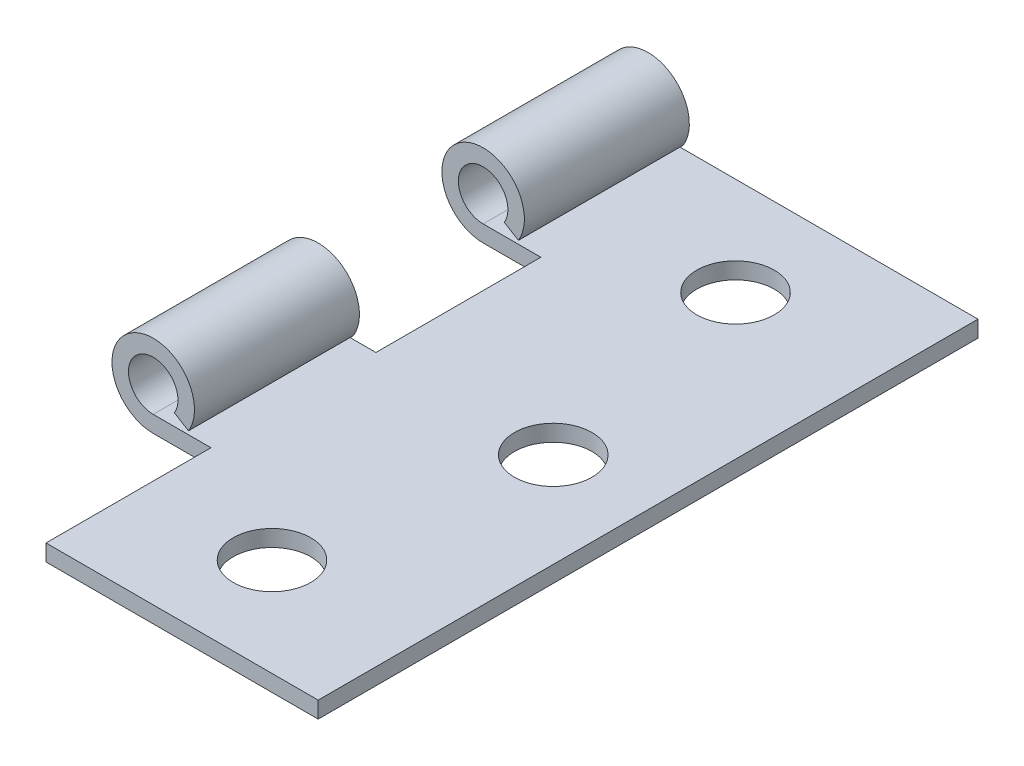
ISO-10303-21;
HEADER;
FILE_DESCRIPTION(('STEP AP214'),'2;1');
FILE_NAME('part.step','',(''),(''),'','','');
FILE_SCHEMA(('AUTOMOTIVE_DESIGN { 1 0 10303 214 1 1 1 1 }'));
ENDSEC;
DATA;
#1=APPLICATION_CONTEXT('core data for automotive mechanical design processes');
#2=APPLICATION_PROTOCOL_DEFINITION('international standard','automotive_design',2000,#1);
#3=PRODUCT_CONTEXT('',#1,'mechanical');
#4=PRODUCT('Part','Part','',(#3));
#5=PRODUCT_RELATED_PRODUCT_CATEGORY('part','',(#4));
#6=PRODUCT_DEFINITION_FORMATION('','',#4);
#7=PRODUCT_DEFINITION_CONTEXT('part definition',#1,'design');
#8=PRODUCT_DEFINITION('design','',#6,#7);
#9=PRODUCT_DEFINITION_SHAPE('','',#8);
#10=(LENGTH_UNIT() NAMED_UNIT(*) SI_UNIT(.MILLI.,.METRE.));
#11=(NAMED_UNIT(*) PLANE_ANGLE_UNIT() SI_UNIT($,.RADIAN.));
#12=(NAMED_UNIT(*) SI_UNIT($,.STERADIAN.) SOLID_ANGLE_UNIT());
#13=UNCERTAINTY_MEASURE_WITH_UNIT(LENGTH_MEASURE(1.E-05),#10,'distance_accuracy_value','');
#14=(GEOMETRIC_REPRESENTATION_CONTEXT(3) GLOBAL_UNCERTAINTY_ASSIGNED_CONTEXT((#13)) GLOBAL_UNIT_ASSIGNED_CONTEXT((#10,
#11,#12)) REPRESENTATION_CONTEXT('',''));
#15=CARTESIAN_POINT('',(0.,0.,0.));
#16=DIRECTION('',(0.,0.,1.));
#17=DIRECTION('',(1.,0.,0.));
#18=AXIS2_PLACEMENT_3D('',#15,#16,#17);
#19=CARTESIAN_POINT('',(0.,0.,40.));
#20=DIRECTION('',(0.,0.,-1.));
#21=DIRECTION('',(-1.,0.,0.));
#22=AXIS2_PLACEMENT_3D('',#19,#20,#21);
#23=CYLINDRICAL_SURFACE('',#22,1.5);
#24=DIRECTION('',(0.,0.,-1.));
#25=VECTOR('',#24,1.);
#26=CARTESIAN_POINT('',(1.28330701874384,-0.776610002280936,40.));
#27=LINE('',#26,#25);
#28=CARTESIAN_POINT('',(1.28330701874384,-0.776610002280936,9.99999999999999));
#29=VERTEX_POINT('',#28);
#30=CARTESIAN_POINT('',(1.28330701874384,-0.776610002280936,0.));
#31=VERTEX_POINT('',#30);
#32=EDGE_CURVE('E238',#29,#31,#27,.T.);
#33=ORIENTED_EDGE('',*,*,#32,.F.);
#34=CARTESIAN_POINT('',(0.,0.,9.99999999999999));
#35=DIRECTION('',(0.,0.,-1.));
#36=DIRECTION('',(-1.,0.,0.));
#37=AXIS2_PLACEMENT_3D('',#34,#35,#36);
#38=CIRCLE('',#37,1.5);
#39=CARTESIAN_POINT('',(0.,-1.5,9.99999999999999));
#40=VERTEX_POINT('',#39);
#41=EDGE_CURVE('E193',#29,#40,#38,.F.);
#42=ORIENTED_EDGE('',*,*,#41,.T.);
#43=DIRECTION('',(0.,0.,-1.));
#44=VECTOR('',#43,1.);
#45=CARTESIAN_POINT('',(0.,-1.5,40.));
#46=LINE('',#45,#44);
#47=CARTESIAN_POINT('',(0.,-1.5,0.));
#48=VERTEX_POINT('',#47);
#49=EDGE_CURVE('E210',#40,#48,#46,.T.);
#50=ORIENTED_EDGE('',*,*,#49,.T.);
#51=CARTESIAN_POINT('',(0.,0.,0.));
#52=DIRECTION('',(0.,0.,-1.));
#53=DIRECTION('',(-1.,0.,0.));
#54=AXIS2_PLACEMENT_3D('',#51,#52,#53);
#55=CIRCLE('',#54,1.5);
#56=EDGE_CURVE('E201',#48,#31,#55,.T.);
#57=ORIENTED_EDGE('',*,*,#56,.T.);
#58=EDGE_LOOP('',(#33,#42,#50,#57));
#59=FACE_BOUND('',#58,.T.);
#60=ADVANCED_FACE('F33',(#59),#23,.F.);
#61=CARTESIAN_POINT('',(2.13884503123973,-1.29435000380156,40.));
#62=DIRECTION('',(-0.517740001520625,-0.855538012495893,0.));
#63=DIRECTION('',(0.855538012495893,-0.517740001520625,0.));
#64=AXIS2_PLACEMENT_3D('',#61,#62,#63);
#65=PLANE('',#64);
#66=DIRECTION('',(0.855538012495893,-0.517740001520625,0.));
#67=VECTOR('',#66,1.);
#68=CARTESIAN_POINT('',(2.13884503123973,-1.29435000380156,9.99999999999999));
#69=LINE('',#68,#67);
#70=CARTESIAN_POINT('',(2.13884503123973,-1.29435000380156,9.99999999999999));
#71=VERTEX_POINT('',#70);
#72=EDGE_CURVE('E196',#29,#71,#69,.T.);
#73=ORIENTED_EDGE('',*,*,#72,.F.);
#74=ORIENTED_EDGE('',*,*,#32,.T.);
#75=DIRECTION('',(-0.855538012495893,0.517740001520625,0.));
#76=VECTOR('',#75,1.);
#77=CARTESIAN_POINT('',(2.13884503123973,-1.29435000380156,0.));
#78=LINE('',#77,#76);
#79=CARTESIAN_POINT('',(2.13884503123973,-1.29435000380156,0.));
#80=VERTEX_POINT('',#79);
#81=EDGE_CURVE('E213',#80,#31,#78,.T.);
#82=ORIENTED_EDGE('',*,*,#81,.F.);
#83=DIRECTION('',(0.,0.,-1.));
#84=VECTOR('',#83,1.);
#85=CARTESIAN_POINT('',(2.13884503123973,-1.29435000380156,40.));
#86=LINE('',#85,#84);
#87=EDGE_CURVE('E235',#71,#80,#86,.T.);
#88=ORIENTED_EDGE('',*,*,#87,.F.);
#89=EDGE_LOOP('',(#73,#74,#82,#88));
#90=FACE_BOUND('',#89,.T.);
#91=ADVANCED_FACE('F277',(#90),#65,.T.);
#92=CARTESIAN_POINT('',(0.,0.,40.));
#93=DIRECTION('',(0.,0.,-1.));
#94=DIRECTION('',(-1.,0.,0.));
#95=AXIS2_PLACEMENT_3D('',#92,#93,#94);
#96=CYLINDRICAL_SURFACE('',#95,2.5);
#97=CARTESIAN_POINT('',(0.,0.,30.));
#98=DIRECTION('',(0.,0.,-1.));
#99=DIRECTION('',(-1.,0.,0.));
#100=AXIS2_PLACEMENT_3D('',#97,#98,#99);
#101=CIRCLE('',#100,2.5);
#102=CARTESIAN_POINT('',(2.13884503123973,-1.29435000380156,30.));
#103=VERTEX_POINT('',#102);
#104=CARTESIAN_POINT('',(0.,-2.5,30.));
#105=VERTEX_POINT('',#104);
#106=EDGE_CURVE('E148',#103,#105,#101,.F.);
#107=ORIENTED_EDGE('',*,*,#106,.F.);
#108=CARTESIAN_POINT('',(2.13884503123973,-1.29435000380156,20.));
#109=VERTEX_POINT('',#108);
#110=EDGE_CURVE('E236',#103,#109,#86,.T.);
#111=ORIENTED_EDGE('',*,*,#110,.T.);
#112=CARTESIAN_POINT('',(0.,0.,20.));
#113=DIRECTION('',(0.,0.,1.));
#114=DIRECTION('',(1.,0.,0.));
#115=AXIS2_PLACEMENT_3D('',#112,#113,#114);
#116=CIRCLE('',#115,2.5);
#117=CARTESIAN_POINT('',(0.,-2.5,20.));
#118=VERTEX_POINT('',#117);
#119=EDGE_CURVE('E190',#118,#109,#116,.F.);
#120=ORIENTED_EDGE('',*,*,#119,.F.);
#121=DIRECTION('',(0.,0.,-1.));
#122=VECTOR('',#121,1.);
#123=CARTESIAN_POINT('',(0.,-2.5,40.));
#124=LINE('',#123,#122);
#125=EDGE_CURVE('E233',#105,#118,#124,.T.);
#126=ORIENTED_EDGE('',*,*,#125,.F.);
#127=EDGE_LOOP('',(#107,#111,#120,#126));
#128=FACE_BOUND('',#127,.T.);
#129=ADVANCED_FACE('F282',(#128),#96,.T.);
#130=CARTESIAN_POINT('',(1.28330701874384,-0.776610002280936,30.));
#131=VERTEX_POINT('',#130);
#132=CARTESIAN_POINT('',(1.28330701874384,-0.776610002280936,20.));
#133=VERTEX_POINT('',#132);
#134=EDGE_CURVE('E239',#131,#133,#27,.T.);
#135=ORIENTED_EDGE('',*,*,#134,.F.);
#136=CARTESIAN_POINT('',(0.,0.,30.));
#137=DIRECTION('',(0.,0.,-1.));
#138=DIRECTION('',(-1.,0.,0.));
#139=AXIS2_PLACEMENT_3D('',#136,#137,#138);
#140=CIRCLE('',#139,1.5);
#141=CARTESIAN_POINT('',(0.,-1.5,30.));
#142=VERTEX_POINT('',#141);
#143=EDGE_CURVE('E165',#131,#142,#140,.F.);
#144=ORIENTED_EDGE('',*,*,#143,.T.);
#145=CARTESIAN_POINT('',(0.,-1.5,20.));
#146=VERTEX_POINT('',#145);
#147=EDGE_CURVE('E58',#142,#146,#46,.T.);
#148=ORIENTED_EDGE('',*,*,#147,.T.);
#149=CARTESIAN_POINT('',(0.,0.,20.));
#150=DIRECTION('',(0.,0.,1.));
#151=DIRECTION('',(1.,0.,0.));
#152=AXIS2_PLACEMENT_3D('',#149,#150,#151);
#153=CIRCLE('',#152,1.5);
#154=EDGE_CURVE('E183',#146,#133,#153,.F.);
#155=ORIENTED_EDGE('',*,*,#154,.T.);
#156=EDGE_LOOP('',(#135,#144,#148,#155));
#157=FACE_BOUND('',#156,.T.);
#158=ADVANCED_FACE('F35',(#157),#23,.F.);
#159=DIRECTION('',(0.855538012495893,-0.517740001520625,0.));
#160=VECTOR('',#159,1.);
#161=CARTESIAN_POINT('',(2.13884503123973,-1.29435000380156,30.));
#162=LINE('',#161,#160);
#163=EDGE_CURVE('E167',#131,#103,#162,.T.);
#164=ORIENTED_EDGE('',*,*,#163,.F.);
#165=ORIENTED_EDGE('',*,*,#134,.T.);
#166=DIRECTION('',(-0.855538012495893,0.517740001520625,0.));
#167=VECTOR('',#166,1.);
#168=CARTESIAN_POINT('',(2.13884503123973,-1.29435000380156,20.));
#169=LINE('',#168,#167);
#170=EDGE_CURVE('E187',#109,#133,#169,.T.);
#171=ORIENTED_EDGE('',*,*,#170,.F.);
#172=ORIENTED_EDGE('',*,*,#110,.F.);
#173=EDGE_LOOP('',(#164,#165,#171,#172));
#174=FACE_BOUND('',#173,.T.);
#175=ADVANCED_FACE('F284',(#174),#65,.T.);
#176=CARTESIAN_POINT('',(0.,0.,9.99999999999999));
#177=DIRECTION('',(0.,0.,-1.));
#178=DIRECTION('',(-1.,0.,0.));
#179=AXIS2_PLACEMENT_3D('',#176,#177,#178);
#180=CIRCLE('',#179,2.5);
#181=CARTESIAN_POINT('',(0.,-2.5,10.));
#182=VERTEX_POINT('',#181);
#183=EDGE_CURVE('E199',#71,#182,#180,.F.);
#184=ORIENTED_EDGE('',*,*,#183,.F.);
#185=ORIENTED_EDGE('',*,*,#87,.T.);
#186=CARTESIAN_POINT('',(0.,0.,0.));
#187=DIRECTION('',(0.,0.,1.));
#188=DIRECTION('',(1.,0.,0.));
#189=AXIS2_PLACEMENT_3D('',#186,#187,#188);
#190=CIRCLE('',#189,2.5);
#191=CARTESIAN_POINT('',(0.,-2.5,0.));
#192=VERTEX_POINT('',#191);
#193=EDGE_CURVE('E216',#192,#80,#190,.F.);
#194=ORIENTED_EDGE('',*,*,#193,.F.);
#195=EDGE_CURVE('E232',#182,#192,#124,.T.);
#196=ORIENTED_EDGE('',*,*,#195,.F.);
#197=EDGE_LOOP('',(#184,#185,#194,#196));
#198=FACE_BOUND('',#197,.T.);
#199=ADVANCED_FACE('F291',(#198),#96,.T.);
#200=CARTESIAN_POINT('',(20.,-2.5,40.));
#201=DIRECTION('',(0.,-1.,0.));
#202=DIRECTION('',(1.,0.,0.));
#203=AXIS2_PLACEMENT_3D('',#200,#201,#202);
#204=PLANE('',#203);
#205=CARTESIAN_POINT('',(11.25,-2.5,5.95));
#206=DIRECTION('',(0.,-1.,0.));
#207=DIRECTION('',(1.,0.,0.));
#208=AXIS2_PLACEMENT_3D('',#205,#206,#207);
#209=CIRCLE('',#208,2.35);
#210=CARTESIAN_POINT('',(13.6,-2.5,5.95));
#211=VERTEX_POINT('',#210);
#212=EDGE_CURVE('E253',#211,#211,#209,.T.);
#213=ORIENTED_EDGE('',*,*,#212,.F.);
#214=EDGE_LOOP('',(#213));
#215=FACE_BOUND('',#214,.T.);
#216=CARTESIAN_POINT('',(11.25,-2.5,34.05));
#217=DIRECTION('',(0.,-1.,0.));
#218=DIRECTION('',(1.,0.,0.));
#219=AXIS2_PLACEMENT_3D('',#216,#217,#218);
#220=CIRCLE('',#219,2.35);
#221=CARTESIAN_POINT('',(13.6,-2.5,34.05));
#222=VERTEX_POINT('',#221);
#223=EDGE_CURVE('E250',#222,#222,#220,.T.);
#224=ORIENTED_EDGE('',*,*,#223,.F.);
#225=EDGE_LOOP('',(#224));
#226=FACE_BOUND('',#225,.T.);
#227=CARTESIAN_POINT('',(14.25,-2.5,20.));
#228=DIRECTION('',(0.,-1.,0.));
#229=DIRECTION('',(1.,0.,0.));
#230=AXIS2_PLACEMENT_3D('',#227,#228,#229);
#231=CIRCLE('',#230,2.35);
#232=CARTESIAN_POINT('',(16.6,-2.5,20.));
#233=VERTEX_POINT('',#232);
#234=EDGE_CURVE('E156',#233,#233,#231,.T.);
#235=ORIENTED_EDGE('',*,*,#234,.F.);
#236=EDGE_LOOP('',(#235));
#237=FACE_BOUND('',#236,.T.);
#238=DIRECTION('',(-1.,0.,0.));
#239=VECTOR('',#238,1.);
#240=CARTESIAN_POINT('',(-2.5,-2.5,30.));
#241=LINE('',#240,#239);
#242=CARTESIAN_POINT('',(3.5,-2.5,30.));
#243=VERTEX_POINT('',#242);
#244=EDGE_CURVE('E145',#243,#105,#241,.T.);
#245=ORIENTED_EDGE('',*,*,#244,.T.);
#246=ORIENTED_EDGE('',*,*,#125,.T.);
#247=DIRECTION('',(1.,0.,0.));
#248=VECTOR('',#247,1.);
#249=CARTESIAN_POINT('',(-2.5,-2.5,20.));
#250=LINE('',#249,#248);
#251=CARTESIAN_POINT('',(3.5,-2.5,20.));
#252=VERTEX_POINT('',#251);
#253=EDGE_CURVE('E170',#118,#252,#250,.T.);
#254=ORIENTED_EDGE('',*,*,#253,.T.);
#255=DIRECTION('',(0.,0.,-1.));
#256=VECTOR('',#255,1.);
#257=CARTESIAN_POINT('',(3.5,-2.5,10.));
#258=LINE('',#257,#256);
#259=CARTESIAN_POINT('',(3.5,-2.5,10.));
#260=VERTEX_POINT('',#259);
#261=EDGE_CURVE('E173',#252,#260,#258,.T.);
#262=ORIENTED_EDGE('',*,*,#261,.T.);
#263=DIRECTION('',(-1.,0.,0.));
#264=VECTOR('',#263,1.);
#265=CARTESIAN_POINT('',(-2.5,-2.5,10.));
#266=LINE('',#265,#264);
#267=EDGE_CURVE('E176',#260,#182,#266,.T.);
#268=ORIENTED_EDGE('',*,*,#267,.T.);
#269=ORIENTED_EDGE('',*,*,#195,.T.);
#270=DIRECTION('',(-1.,0.,0.));
#271=VECTOR('',#270,1.);
#272=CARTESIAN_POINT('',(20.,-2.5,0.));
#273=LINE('',#272,#271);
#274=CARTESIAN_POINT('',(20.,-2.5,0.));
#275=VERTEX_POINT('',#274);
#276=EDGE_CURVE('E219',#275,#192,#273,.T.);
#277=ORIENTED_EDGE('',*,*,#276,.F.);
#278=DIRECTION('',(0.,0.,-1.));
#279=VECTOR('',#278,1.);
#280=CARTESIAN_POINT('',(20.,-2.5,40.));
#281=LINE('',#280,#279);
#282=CARTESIAN_POINT('',(20.,-2.5,40.));
#283=VERTEX_POINT('',#282);
#284=EDGE_CURVE('E230',#283,#275,#281,.T.);
#285=ORIENTED_EDGE('',*,*,#284,.F.);
#286=DIRECTION('',(-1.,0.,0.));
#287=VECTOR('',#286,1.);
#288=CARTESIAN_POINT('',(20.,-2.5,40.));
#289=LINE('',#288,#287);
#290=CARTESIAN_POINT('',(3.5,-2.5,40.));
#291=VERTEX_POINT('',#290);
#292=EDGE_CURVE('E155',#283,#291,#289,.T.);
#293=ORIENTED_EDGE('',*,*,#292,.T.);
#294=DIRECTION('',(0.,0.,-1.));
#295=VECTOR('',#294,1.);
#296=CARTESIAN_POINT('',(3.5,-2.5,30.));
#297=LINE('',#296,#295);
#298=EDGE_CURVE('E50',#291,#243,#297,.T.);
#299=ORIENTED_EDGE('',*,*,#298,.T.);
#300=EDGE_LOOP('',(#245,#246,#254,#262,#268,#269,#277,#285,#293,#299));
#301=FACE_BOUND('',#300,.T.);
#302=ADVANCED_FACE('F153',(#215,#226,#237,#301),#204,.T.);
#303=CARTESIAN_POINT('',(20.,-1.5,40.));
#304=DIRECTION('',(1.,0.,0.));
#305=DIRECTION('',(0.,0.,-1.));
#306=AXIS2_PLACEMENT_3D('',#303,#304,#305);
#307=PLANE('',#306);
#308=DIRECTION('',(0.,-1.,0.));
#309=VECTOR('',#308,1.);
#310=CARTESIAN_POINT('',(20.,-1.5,0.));
#311=LINE('',#310,#309);
#312=CARTESIAN_POINT('',(20.,-1.5,0.));
#313=VERTEX_POINT('',#312);
#314=EDGE_CURVE('E222',#313,#275,#311,.T.);
#315=ORIENTED_EDGE('',*,*,#314,.F.);
#316=DIRECTION('',(0.,0.,-1.));
#317=VECTOR('',#316,1.);
#318=CARTESIAN_POINT('',(20.,-1.5,40.));
#319=LINE('',#318,#317);
#320=CARTESIAN_POINT('',(20.,-1.5,40.));
#321=VERTEX_POINT('',#320);
#322=EDGE_CURVE('E228',#321,#313,#319,.T.);
#323=ORIENTED_EDGE('',*,*,#322,.F.);
#324=DIRECTION('',(0.,-1.,0.));
#325=VECTOR('',#324,1.);
#326=CARTESIAN_POINT('',(20.,-1.5,40.));
#327=LINE('',#326,#325);
#328=EDGE_CURVE('E203',#321,#283,#327,.T.);
#329=ORIENTED_EDGE('',*,*,#328,.T.);
#330=ORIENTED_EDGE('',*,*,#284,.T.);
#331=EDGE_LOOP('',(#315,#323,#329,#330));
#332=FACE_BOUND('',#331,.T.);
#333=ADVANCED_FACE('F325',(#332),#307,.T.);
#334=CARTESIAN_POINT('',(20.,-1.5,40.));
#335=DIRECTION('',(0.,-1.,0.));
#336=DIRECTION('',(1.,0.,0.));
#337=AXIS2_PLACEMENT_3D('',#334,#335,#336);
#338=PLANE('',#337);
#339=CARTESIAN_POINT('',(11.25,-1.5,5.95));
#340=DIRECTION('',(0.,-1.,0.));
#341=DIRECTION('',(1.,0.,0.));
#342=AXIS2_PLACEMENT_3D('',#339,#340,#341);
#343=CIRCLE('',#342,2.35);
#344=CARTESIAN_POINT('',(13.6,-1.5,5.95));
#345=VERTEX_POINT('',#344);
#346=EDGE_CURVE('E37',#345,#345,#343,.T.);
#347=ORIENTED_EDGE('',*,*,#346,.T.);
#348=EDGE_LOOP('',(#347));
#349=FACE_BOUND('',#348,.T.);
#350=CARTESIAN_POINT('',(11.25,-1.5,34.05));
#351=DIRECTION('',(0.,-1.,0.));
#352=DIRECTION('',(1.,0.,0.));
#353=AXIS2_PLACEMENT_3D('',#350,#351,#352);
#354=CIRCLE('',#353,2.35);
#355=CARTESIAN_POINT('',(13.6,-1.5,34.05));
#356=VERTEX_POINT('',#355);
#357=EDGE_CURVE('E251',#356,#356,#354,.T.);
#358=ORIENTED_EDGE('',*,*,#357,.T.);
#359=EDGE_LOOP('',(#358));
#360=FACE_BOUND('',#359,.T.);
#361=CARTESIAN_POINT('',(14.25,-1.5,20.));
#362=DIRECTION('',(0.,-1.,0.));
#363=DIRECTION('',(1.,0.,0.));
#364=AXIS2_PLACEMENT_3D('',#361,#362,#363);
#365=CIRCLE('',#364,2.35);
#366=CARTESIAN_POINT('',(16.6,-1.5,20.));
#367=VERTEX_POINT('',#366);
#368=EDGE_CURVE('E159',#367,#367,#365,.T.);
#369=ORIENTED_EDGE('',*,*,#368,.T.);
#370=EDGE_LOOP('',(#369));
#371=FACE_BOUND('',#370,.T.);
#372=ORIENTED_EDGE('',*,*,#147,.F.);
#373=DIRECTION('',(1.,0.,0.));
#374=VECTOR('',#373,1.);
#375=CARTESIAN_POINT('',(20.,-1.5,30.));
#376=LINE('',#375,#374);
#377=CARTESIAN_POINT('',(3.5,-1.5,30.));
#378=VERTEX_POINT('',#377);
#379=EDGE_CURVE('E11',#142,#378,#376,.T.);
#380=ORIENTED_EDGE('',*,*,#379,.T.);
#381=DIRECTION('',(0.,0.,1.));
#382=VECTOR('',#381,1.);
#383=CARTESIAN_POINT('',(3.5,-1.5,40.));
#384=LINE('',#383,#382);
#385=CARTESIAN_POINT('',(3.5,-1.5,40.));
#386=VERTEX_POINT('',#385);
#387=EDGE_CURVE('E140',#378,#386,#384,.T.);
#388=ORIENTED_EDGE('',*,*,#387,.T.);
#389=DIRECTION('',(-1.,0.,0.));
#390=VECTOR('',#389,1.);
#391=CARTESIAN_POINT('',(20.,-1.5,40.));
#392=LINE('',#391,#390);
#393=EDGE_CURVE('E207',#321,#386,#392,.T.);
#394=ORIENTED_EDGE('',*,*,#393,.F.);
#395=ORIENTED_EDGE('',*,*,#322,.T.);
#396=DIRECTION('',(-1.,0.,0.));
#397=VECTOR('',#396,1.);
#398=CARTESIAN_POINT('',(20.,-1.5,0.));
#399=LINE('',#398,#397);
#400=EDGE_CURVE('E204',#313,#48,#399,.T.);
#401=ORIENTED_EDGE('',*,*,#400,.T.);
#402=ORIENTED_EDGE('',*,*,#49,.F.);
#403=DIRECTION('',(1.,0.,0.));
#404=VECTOR('',#403,1.);
#405=CARTESIAN_POINT('',(20.,-1.5,9.99999999999999));
#406=LINE('',#405,#404);
#407=CARTESIAN_POINT('',(3.5,-1.5,10.));
#408=VERTEX_POINT('',#407);
#409=EDGE_CURVE('E42',#40,#408,#406,.T.);
#410=ORIENTED_EDGE('',*,*,#409,.T.);
#411=DIRECTION('',(0.,0.,1.));
#412=VECTOR('',#411,1.);
#413=CARTESIAN_POINT('',(3.50000000000001,-1.5,40.));
#414=LINE('',#413,#412);
#415=CARTESIAN_POINT('',(3.5,-1.5,20.));
#416=VERTEX_POINT('',#415);
#417=EDGE_CURVE('E244',#408,#416,#414,.T.);
#418=ORIENTED_EDGE('',*,*,#417,.T.);
#419=DIRECTION('',(-1.,0.,0.));
#420=VECTOR('',#419,1.);
#421=CARTESIAN_POINT('',(20.,-1.5,20.));
#422=LINE('',#421,#420);
#423=EDGE_CURVE('E241',#416,#146,#422,.T.);
#424=ORIENTED_EDGE('',*,*,#423,.T.);
#425=EDGE_LOOP('',(#372,#380,#388,#394,#395,#401,#402,#410,#418,#424));
#426=FACE_BOUND('',#425,.T.);
#427=ADVANCED_FACE('F264',(#349,#360,#371,#426),#338,.F.);
#428=CARTESIAN_POINT('',(0.,0.,40.));
#429=DIRECTION('',(0.,0.,-1.));
#430=DIRECTION('',(-1.,0.,0.));
#431=AXIS2_PLACEMENT_3D('',#428,#429,#430);
#432=PLANE('',#431);
#433=ORIENTED_EDGE('',*,*,#393,.T.);
#434=DIRECTION('',(0.,1.,0.));
#435=VECTOR('',#434,1.);
#436=CARTESIAN_POINT('',(3.5,-2.5,40.));
#437=LINE('',#436,#435);
#438=EDGE_CURVE('E142',#291,#386,#437,.T.);
#439=ORIENTED_EDGE('',*,*,#438,.F.);
#440=ORIENTED_EDGE('',*,*,#292,.F.);
#441=ORIENTED_EDGE('',*,*,#328,.F.);
#442=EDGE_LOOP('',(#433,#439,#440,#441));
#443=FACE_BOUND('',#442,.T.);
#444=ADVANCED_FACE('F324',(#443),#432,.F.);
#445=CARTESIAN_POINT('',(0.,0.,0.));
#446=DIRECTION('',(0.,0.,-1.));
#447=DIRECTION('',(-1.,0.,0.));
#448=AXIS2_PLACEMENT_3D('',#445,#446,#447);
#449=PLANE('',#448);
#450=ORIENTED_EDGE('',*,*,#56,.F.);
#451=ORIENTED_EDGE('',*,*,#400,.F.);
#452=ORIENTED_EDGE('',*,*,#314,.T.);
#453=ORIENTED_EDGE('',*,*,#276,.T.);
#454=ORIENTED_EDGE('',*,*,#193,.T.);
#455=ORIENTED_EDGE('',*,*,#81,.T.);
#456=EDGE_LOOP('',(#450,#451,#452,#453,#454,#455));
#457=FACE_BOUND('',#456,.T.);
#458=ADVANCED_FACE('F318',(#457),#449,.T.);
#459=CARTESIAN_POINT('',(3.5,-2.5,10.));
#460=DIRECTION('',(1.,0.,0.));
#461=DIRECTION('',(0.,0.,-1.));
#462=AXIS2_PLACEMENT_3D('',#459,#460,#461);
#463=PLANE('',#462);
#464=DIRECTION('',(0.,1.,0.));
#465=VECTOR('',#464,1.);
#466=CARTESIAN_POINT('',(3.5,-2.5,10.));
#467=LINE('',#466,#465);
#468=EDGE_CURVE('E180',#260,#408,#467,.T.);
#469=ORIENTED_EDGE('',*,*,#468,.F.);
#470=ORIENTED_EDGE('',*,*,#261,.F.);
#471=DIRECTION('',(0.,1.,0.));
#472=VECTOR('',#471,1.);
#473=CARTESIAN_POINT('',(3.5,-2.5,20.));
#474=LINE('',#473,#472);
#475=EDGE_CURVE('E179',#252,#416,#474,.T.);
#476=ORIENTED_EDGE('',*,*,#475,.T.);
#477=ORIENTED_EDGE('',*,*,#417,.F.);
#478=EDGE_LOOP('',(#469,#470,#476,#477));
#479=FACE_BOUND('',#478,.T.);
#480=ADVANCED_FACE('F307',(#479),#463,.F.);
#481=CARTESIAN_POINT('',(-2.5,-2.5,10.));
#482=DIRECTION('',(0.,0.,-1.));
#483=DIRECTION('',(-1.,0.,0.));
#484=AXIS2_PLACEMENT_3D('',#481,#482,#483);
#485=PLANE('',#484);
#486=ORIENTED_EDGE('',*,*,#183,.T.);
#487=ORIENTED_EDGE('',*,*,#267,.F.);
#488=ORIENTED_EDGE('',*,*,#468,.T.);
#489=ORIENTED_EDGE('',*,*,#409,.F.);
#490=ORIENTED_EDGE('',*,*,#41,.F.);
#491=ORIENTED_EDGE('',*,*,#72,.T.);
#492=EDGE_LOOP('',(#486,#487,#488,#489,#490,#491));
#493=FACE_BOUND('',#492,.T.);
#494=ADVANCED_FACE('F327',(#493),#485,.F.);
#495=CARTESIAN_POINT('',(-2.5,-2.5,20.));
#496=DIRECTION('',(0.,0.,1.));
#497=DIRECTION('',(1.,0.,0.));
#498=AXIS2_PLACEMENT_3D('',#495,#496,#497);
#499=PLANE('',#498);
#500=ORIENTED_EDGE('',*,*,#119,.T.);
#501=ORIENTED_EDGE('',*,*,#170,.T.);
#502=ORIENTED_EDGE('',*,*,#154,.F.);
#503=ORIENTED_EDGE('',*,*,#423,.F.);
#504=ORIENTED_EDGE('',*,*,#475,.F.);
#505=ORIENTED_EDGE('',*,*,#253,.F.);
#506=EDGE_LOOP('',(#500,#501,#502,#503,#504,#505));
#507=FACE_BOUND('',#506,.T.);
#508=ADVANCED_FACE('F300',(#507),#499,.F.);
#509=CARTESIAN_POINT('',(3.5,-2.5,30.));
#510=DIRECTION('',(1.,0.,0.));
#511=DIRECTION('',(0.,0.,-1.));
#512=AXIS2_PLACEMENT_3D('',#509,#510,#511);
#513=PLANE('',#512);
#514=DIRECTION('',(0.,1.,0.));
#515=VECTOR('',#514,1.);
#516=CARTESIAN_POINT('',(3.5,-2.5,30.));
#517=LINE('',#516,#515);
#518=EDGE_CURVE('E136',#243,#378,#517,.T.);
#519=ORIENTED_EDGE('',*,*,#518,.F.);
#520=ORIENTED_EDGE('',*,*,#298,.F.);
#521=ORIENTED_EDGE('',*,*,#438,.T.);
#522=ORIENTED_EDGE('',*,*,#387,.F.);
#523=EDGE_LOOP('',(#519,#520,#521,#522));
#524=FACE_BOUND('',#523,.T.);
#525=ADVANCED_FACE('F138',(#524),#513,.F.);
#526=CARTESIAN_POINT('',(-2.5,-2.5,30.));
#527=DIRECTION('',(0.,0.,-1.));
#528=DIRECTION('',(-1.,0.,0.));
#529=AXIS2_PLACEMENT_3D('',#526,#527,#528);
#530=PLANE('',#529);
#531=ORIENTED_EDGE('',*,*,#106,.T.);
#532=ORIENTED_EDGE('',*,*,#244,.F.);
#533=ORIENTED_EDGE('',*,*,#518,.T.);
#534=ORIENTED_EDGE('',*,*,#379,.F.);
#535=ORIENTED_EDGE('',*,*,#143,.F.);
#536=ORIENTED_EDGE('',*,*,#163,.T.);
#537=EDGE_LOOP('',(#531,#532,#533,#534,#535,#536));
#538=FACE_BOUND('',#537,.T.);
#539=ADVANCED_FACE('F146',(#538),#530,.F.);
#540=CARTESIAN_POINT('',(14.25,-10.,20.));
#541=DIRECTION('',(0.,1.,0.));
#542=DIRECTION('',(0.,0.,1.));
#543=AXIS2_PLACEMENT_3D('',#540,#541,#542);
#544=CYLINDRICAL_SURFACE('',#543,2.35);
#545=ORIENTED_EDGE('',*,*,#234,.T.);
#546=EDGE_LOOP('',(#545));
#547=FACE_BOUND('',#546,.T.);
#548=ORIENTED_EDGE('',*,*,#368,.F.);
#549=EDGE_LOOP('',(#548));
#550=FACE_BOUND('',#549,.T.);
#551=ADVANCED_FACE('F273',(#547,#550),#544,.F.);
#552=CARTESIAN_POINT('',(11.25,-10.,34.05));
#553=DIRECTION('',(0.,1.,0.));
#554=DIRECTION('',(0.,0.,1.));
#555=AXIS2_PLACEMENT_3D('',#552,#553,#554);
#556=CYLINDRICAL_SURFACE('',#555,2.35);
#557=ORIENTED_EDGE('',*,*,#223,.T.);
#558=EDGE_LOOP('',(#557));
#559=FACE_BOUND('',#558,.T.);
#560=ORIENTED_EDGE('',*,*,#357,.F.);
#561=EDGE_LOOP('',(#560));
#562=FACE_BOUND('',#561,.T.);
#563=ADVANCED_FACE('F268',(#559,#562),#556,.F.);
#564=CARTESIAN_POINT('',(11.25,-10.,5.95));
#565=DIRECTION('',(0.,1.,0.));
#566=DIRECTION('',(0.,0.,1.));
#567=AXIS2_PLACEMENT_3D('',#564,#565,#566);
#568=CYLINDRICAL_SURFACE('',#567,2.35);
#569=ORIENTED_EDGE('',*,*,#212,.T.);
#570=EDGE_LOOP('',(#569));
#571=FACE_BOUND('',#570,.T.);
#572=ORIENTED_EDGE('',*,*,#346,.F.);
#573=EDGE_LOOP('',(#572));
#574=FACE_BOUND('',#573,.T.);
#575=ADVANCED_FACE('F266',(#571,#574),#568,.F.);
#576=CLOSED_SHELL('',(#60,#91,#129,#158,#175,#199,#302,#333,#427,#444,#458,#480,#494,#508,#525,
#539,#551,#563,#575));
#577=MANIFOLD_SOLID_BREP('B2',#576);
#578=ADVANCED_BREP_SHAPE_REPRESENTATION('',(#18,#577),#14);
#579=SHAPE_DEFINITION_REPRESENTATION(#9,#578);
ENDSEC;
END-ISO-10303-21;
